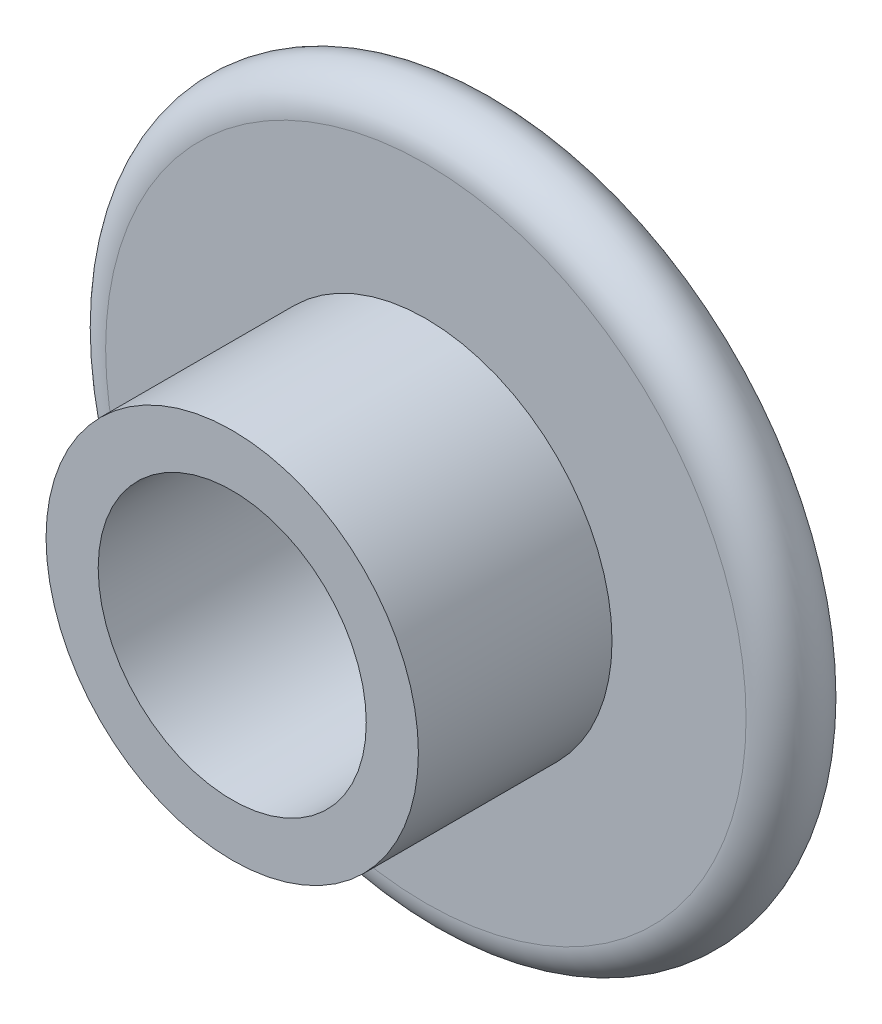
ISO-10303-21;
HEADER;
FILE_DESCRIPTION(('STEP AP214'),'2;1');
FILE_NAME('part.step','',(''),(''),'','','');
FILE_SCHEMA(('AUTOMOTIVE_DESIGN { 1 0 10303 214 1 1 1 1 }'));
ENDSEC;
DATA;
#1=APPLICATION_CONTEXT('core data for automotive mechanical design processes');
#2=APPLICATION_PROTOCOL_DEFINITION('international standard','automotive_design',2000,#1);
#3=PRODUCT_CONTEXT('',#1,'mechanical');
#4=PRODUCT('Part','Part','',(#3));
#5=PRODUCT_RELATED_PRODUCT_CATEGORY('part','',(#4));
#6=PRODUCT_DEFINITION_FORMATION('','',#4);
#7=PRODUCT_DEFINITION_CONTEXT('part definition',#1,'design');
#8=PRODUCT_DEFINITION('design','',#6,#7);
#9=PRODUCT_DEFINITION_SHAPE('','',#8);
#10=(LENGTH_UNIT() NAMED_UNIT(*) SI_UNIT(.MILLI.,.METRE.));
#11=(NAMED_UNIT(*) PLANE_ANGLE_UNIT() SI_UNIT($,.RADIAN.));
#12=(NAMED_UNIT(*) SI_UNIT($,.STERADIAN.) SOLID_ANGLE_UNIT());
#13=UNCERTAINTY_MEASURE_WITH_UNIT(LENGTH_MEASURE(1.E-05),#10,'distance_accuracy_value','');
#14=(GEOMETRIC_REPRESENTATION_CONTEXT(3) GLOBAL_UNCERTAINTY_ASSIGNED_CONTEXT((#13)) GLOBAL_UNIT_ASSIGNED_CONTEXT((#10,
#11,#12)) REPRESENTATION_CONTEXT('',''));
#15=CARTESIAN_POINT('',(0.,0.,0.));
#16=DIRECTION('',(0.,0.,1.));
#17=DIRECTION('',(1.,0.,0.));
#18=AXIS2_PLACEMENT_3D('',#15,#16,#17);
#19=CARTESIAN_POINT('',(18.,0.,0.));
#20=DIRECTION('',(0.,0.,-1.));
#21=DIRECTION('',(-1.,0.,0.));
#22=AXIS2_PLACEMENT_3D('',#19,#20,#21);
#23=PLANE('',#22);
#24=CARTESIAN_POINT('',(0.,0.,0.));
#25=DIRECTION('',(0.,0.,-1.));
#26=DIRECTION('',(-1.,0.,0.));
#27=AXIS2_PLACEMENT_3D('',#24,#25,#26);
#28=CIRCLE('',#27,25.);
#29=CARTESIAN_POINT('',(-25.,0.,0.));
#30=VERTEX_POINT('',#29);
#31=EDGE_CURVE('E66',#30,#30,#28,.T.);
#32=ORIENTED_EDGE('',*,*,#31,.F.);
#33=EDGE_LOOP('',(#32));
#34=FACE_BOUND('',#33,.T.);
#35=CARTESIAN_POINT('',(0.,0.,0.));
#36=DIRECTION('',(0.,0.,-1.));
#37=DIRECTION('',(-1.,0.,0.));
#38=AXIS2_PLACEMENT_3D('',#35,#36,#37);
#39=CIRCLE('',#38,18.);
#40=CARTESIAN_POINT('',(-18.,0.,0.));
#41=VERTEX_POINT('',#40);
#42=EDGE_CURVE('E10',#41,#41,#39,.T.);
#43=ORIENTED_EDGE('',*,*,#42,.T.);
#44=EDGE_LOOP('',(#43));
#45=FACE_BOUND('',#44,.T.);
#46=ADVANCED_FACE('F38',(#34,#45),#23,.F.);
#47=CARTESIAN_POINT('',(0.,0.,-73.9821944018593));
#48=DIRECTION('',(0.,0.,-1.));
#49=DIRECTION('',(-1.,0.,0.));
#50=AXIS2_PLACEMENT_3D('',#47,#48,#49);
#51=CYLINDRICAL_SURFACE('',#50,18.);
#52=ORIENTED_EDGE('',*,*,#42,.F.);
#53=EDGE_LOOP('',(#52));
#54=FACE_BOUND('',#53,.T.);
#55=CARTESIAN_POINT('',(0.,0.,-46.));
#56=DIRECTION('',(0.,0.,-1.));
#57=DIRECTION('',(-1.,0.,0.));
#58=AXIS2_PLACEMENT_3D('',#55,#56,#57);
#59=CIRCLE('',#58,18.);
#60=CARTESIAN_POINT('',(-18.,0.,-46.));
#61=VERTEX_POINT('',#60);
#62=EDGE_CURVE('E44',#61,#61,#59,.T.);
#63=ORIENTED_EDGE('',*,*,#62,.T.);
#64=EDGE_LOOP('',(#63));
#65=FACE_BOUND('',#64,.T.);
#66=ADVANCED_FACE('F73',(#54,#65),#51,.F.);
#67=CARTESIAN_POINT('',(18.,0.,-46.));
#68=DIRECTION('',(0.,0.,1.));
#69=DIRECTION('',(1.,0.,0.));
#70=AXIS2_PLACEMENT_3D('',#67,#68,#69);
#71=PLANE('',#70);
#72=ORIENTED_EDGE('',*,*,#62,.F.);
#73=EDGE_LOOP('',(#72));
#74=FACE_BOUND('',#73,.T.);
#75=CARTESIAN_POINT('',(0.,0.,-46.));
#76=DIRECTION('',(0.,0.,-1.));
#77=DIRECTION('',(-1.,0.,0.));
#78=AXIS2_PLACEMENT_3D('',#75,#76,#77);
#79=CIRCLE('',#78,25.);
#80=CARTESIAN_POINT('',(-25.,0.,-46.));
#81=VERTEX_POINT('',#80);
#82=EDGE_CURVE('E48',#81,#81,#79,.T.);
#83=ORIENTED_EDGE('',*,*,#82,.T.);
#84=EDGE_LOOP('',(#83));
#85=FACE_BOUND('',#84,.T.);
#86=ADVANCED_FACE('F77',(#74,#85),#71,.F.);
#87=CARTESIAN_POINT('',(0.,0.,-73.9821944018593));
#88=DIRECTION('',(0.,0.,-1.));
#89=DIRECTION('',(-1.,0.,0.));
#90=AXIS2_PLACEMENT_3D('',#87,#88,#89);
#91=CYLINDRICAL_SURFACE('',#90,25.);
#92=ORIENTED_EDGE('',*,*,#82,.F.);
#93=EDGE_LOOP('',(#92));
#94=FACE_BOUND('',#93,.T.);
#95=CARTESIAN_POINT('',(0.,0.,-36.));
#96=DIRECTION('',(0.,0.,-1.));
#97=DIRECTION('',(-1.,0.,0.));
#98=AXIS2_PLACEMENT_3D('',#95,#96,#97);
#99=CIRCLE('',#98,25.);
#100=CARTESIAN_POINT('',(-25.,0.,-36.));
#101=VERTEX_POINT('',#100);
#102=EDGE_CURVE('E52',#101,#101,#99,.T.);
#103=ORIENTED_EDGE('',*,*,#102,.T.);
#104=EDGE_LOOP('',(#103));
#105=FACE_BOUND('',#104,.T.);
#106=ADVANCED_FACE('F82',(#94,#105),#91,.T.);
#107=CARTESIAN_POINT('',(25.,0.,-36.));
#108=DIRECTION('',(0.,0.,1.));
#109=DIRECTION('',(1.,0.,0.));
#110=AXIS2_PLACEMENT_3D('',#107,#108,#109);
#111=PLANE('',#110);
#112=ORIENTED_EDGE('',*,*,#102,.F.);
#113=EDGE_LOOP('',(#112));
#114=FACE_BOUND('',#113,.T.);
#115=CARTESIAN_POINT('',(0.,0.,-36.));
#116=DIRECTION('',(0.,0.,-1.));
#117=DIRECTION('',(-1.,0.,0.));
#118=AXIS2_PLACEMENT_3D('',#115,#116,#117);
#119=CIRCLE('',#118,43.);
#120=CARTESIAN_POINT('',(-43.,0.,-36.));
#121=VERTEX_POINT('',#120);
#122=EDGE_CURVE('E57',#121,#121,#119,.T.);
#123=ORIENTED_EDGE('',*,*,#122,.T.);
#124=EDGE_LOOP('',(#123));
#125=FACE_BOUND('',#124,.T.);
#126=ADVANCED_FACE('F88',(#114,#125),#111,.F.);
#127=CARTESIAN_POINT('',(0.,0.,-31.));
#128=DIRECTION('',(0.,0.,-1.));
#129=DIRECTION('',(-1.,0.,0.));
#130=AXIS2_PLACEMENT_3D('',#127,#128,#129);
#131=TOROIDAL_SURFACE('',#130,43.,5.);
#132=ORIENTED_EDGE('',*,*,#122,.F.);
#133=EDGE_LOOP('',(#132));
#134=FACE_BOUND('',#133,.T.);
#135=CARTESIAN_POINT('',(0.,0.,-26.));
#136=DIRECTION('',(0.,0.,-1.));
#137=DIRECTION('',(-1.,0.,0.));
#138=AXIS2_PLACEMENT_3D('',#135,#136,#137);
#139=CIRCLE('',#138,43.);
#140=CARTESIAN_POINT('',(-43.,0.,-26.));
#141=VERTEX_POINT('',#140);
#142=EDGE_CURVE('E60',#141,#141,#139,.T.);
#143=ORIENTED_EDGE('',*,*,#142,.T.);
#144=EDGE_LOOP('',(#143));
#145=FACE_BOUND('',#144,.T.);
#146=ADVANCED_FACE('F92',(#134,#145),#131,.T.);
#147=CARTESIAN_POINT('',(43.,0.,-26.));
#148=DIRECTION('',(0.,0.,-1.));
#149=DIRECTION('',(-1.,0.,0.));
#150=AXIS2_PLACEMENT_3D('',#147,#148,#149);
#151=PLANE('',#150);
#152=ORIENTED_EDGE('',*,*,#142,.F.);
#153=EDGE_LOOP('',(#152));
#154=FACE_BOUND('',#153,.T.);
#155=CARTESIAN_POINT('',(0.,0.,-26.));
#156=DIRECTION('',(0.,0.,-1.));
#157=DIRECTION('',(-1.,0.,0.));
#158=AXIS2_PLACEMENT_3D('',#155,#156,#157);
#159=CIRCLE('',#158,25.);
#160=CARTESIAN_POINT('',(-25.,0.,-26.));
#161=VERTEX_POINT('',#160);
#162=EDGE_CURVE('E63',#161,#161,#159,.T.);
#163=ORIENTED_EDGE('',*,*,#162,.T.);
#164=EDGE_LOOP('',(#163));
#165=FACE_BOUND('',#164,.T.);
#166=ADVANCED_FACE('F96',(#154,#165),#151,.F.);
#167=CARTESIAN_POINT('',(0.,0.,-73.9821944018593));
#168=DIRECTION('',(0.,0.,-1.));
#169=DIRECTION('',(-1.,0.,0.));
#170=AXIS2_PLACEMENT_3D('',#167,#168,#169);
#171=CYLINDRICAL_SURFACE('',#170,25.);
#172=ORIENTED_EDGE('',*,*,#162,.F.);
#173=EDGE_LOOP('',(#172));
#174=FACE_BOUND('',#173,.T.);
#175=ORIENTED_EDGE('',*,*,#31,.T.);
#176=EDGE_LOOP('',(#175));
#177=FACE_BOUND('',#176,.T.);
#178=ADVANCED_FACE('F70',(#174,#177),#171,.T.);
#179=CLOSED_SHELL('',(#46,#66,#86,#106,#126,#146,#166,#178));
#180=MANIFOLD_SOLID_BREP('B2',#179);
#181=ADVANCED_BREP_SHAPE_REPRESENTATION('',(#18,#180),#14);
#182=SHAPE_DEFINITION_REPRESENTATION(#9,#181);
ENDSEC;
END-ISO-10303-21;
